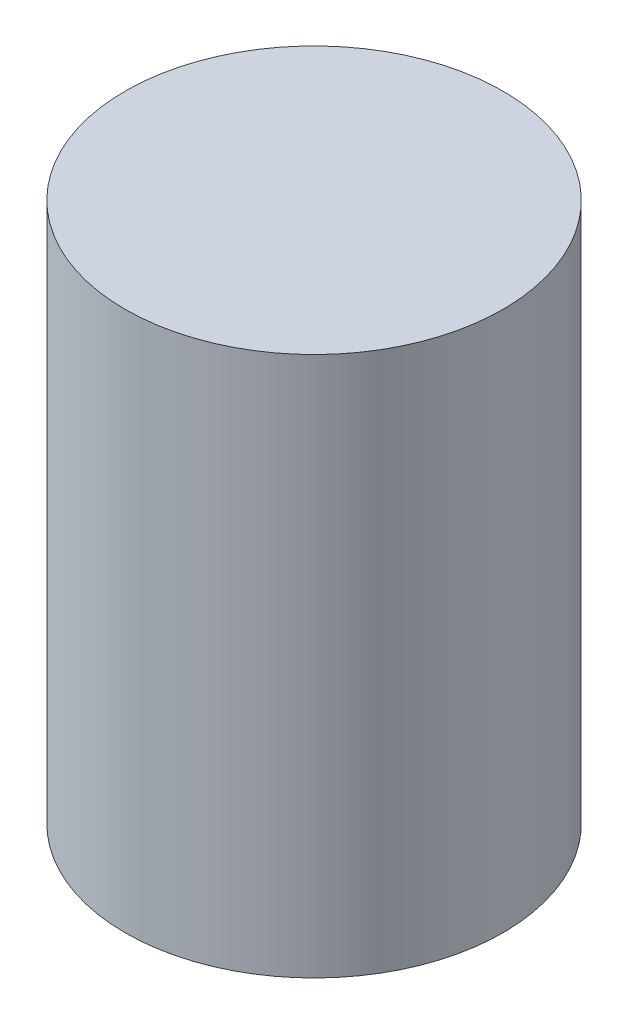
ISO-10303-21;
HEADER;
FILE_DESCRIPTION(('STEP AP214'),'2;1');
FILE_NAME('part.step','',(''),(''),'','','');
FILE_SCHEMA(('AUTOMOTIVE_DESIGN { 1 0 10303 214 1 1 1 1 }'));
ENDSEC;
DATA;
#1=APPLICATION_CONTEXT('core data for automotive mechanical design processes');
#2=APPLICATION_PROTOCOL_DEFINITION('international standard','automotive_design',2000,#1);
#3=PRODUCT_CONTEXT('',#1,'mechanical');
#4=PRODUCT('Part','Part','',(#3));
#5=PRODUCT_RELATED_PRODUCT_CATEGORY('part','',(#4));
#6=PRODUCT_DEFINITION_FORMATION('','',#4);
#7=PRODUCT_DEFINITION_CONTEXT('part definition',#1,'design');
#8=PRODUCT_DEFINITION('design','',#6,#7);
#9=PRODUCT_DEFINITION_SHAPE('','',#8);
#10=(LENGTH_UNIT() NAMED_UNIT(*) SI_UNIT(.MILLI.,.METRE.));
#11=(NAMED_UNIT(*) PLANE_ANGLE_UNIT() SI_UNIT($,.RADIAN.));
#12=(NAMED_UNIT(*) SI_UNIT($,.STERADIAN.) SOLID_ANGLE_UNIT());
#13=UNCERTAINTY_MEASURE_WITH_UNIT(LENGTH_MEASURE(1.E-05),#10,'distance_accuracy_value','');
#14=(GEOMETRIC_REPRESENTATION_CONTEXT(3) GLOBAL_UNCERTAINTY_ASSIGNED_CONTEXT((#13)) GLOBAL_UNIT_ASSIGNED_CONTEXT((#10,
#11,#12)) REPRESENTATION_CONTEXT('',''));
#15=CARTESIAN_POINT('',(0.,0.,0.));
#16=DIRECTION('',(0.,0.,1.));
#17=DIRECTION('',(1.,0.,0.));
#18=AXIS2_PLACEMENT_3D('',#15,#16,#17);
#19=CARTESIAN_POINT('',(0.,30.,0.));
#20=DIRECTION('',(0.,-1.,0.));
#21=DIRECTION('',(0.,0.,-1.));
#22=AXIS2_PLACEMENT_3D('',#19,#20,#21);
#23=CYLINDRICAL_SURFACE('',#22,10.5);
#24=CARTESIAN_POINT('',(0.,30.,0.));
#25=DIRECTION('',(0.,1.,0.));
#26=DIRECTION('',(0.,0.,1.));
#27=AXIS2_PLACEMENT_3D('',#24,#25,#26);
#28=CIRCLE('',#27,10.5);
#29=CARTESIAN_POINT('',(0.,30.,10.5));
#30=VERTEX_POINT('',#29);
#31=EDGE_CURVE('E10',#30,#30,#28,.T.);
#32=ORIENTED_EDGE('',*,*,#31,.F.);
#33=EDGE_LOOP('',(#32));
#34=FACE_BOUND('',#33,.T.);
#35=CARTESIAN_POINT('',(0.,0.,0.));
#36=DIRECTION('',(0.,1.,0.));
#37=DIRECTION('',(0.,0.,1.));
#38=AXIS2_PLACEMENT_3D('',#35,#36,#37);
#39=CIRCLE('',#38,10.5);
#40=CARTESIAN_POINT('',(0.,0.,10.5));
#41=VERTEX_POINT('',#40);
#42=EDGE_CURVE('E34',#41,#41,#39,.T.);
#43=ORIENTED_EDGE('',*,*,#42,.T.);
#44=EDGE_LOOP('',(#43));
#45=FACE_BOUND('',#44,.T.);
#46=ADVANCED_FACE('F31',(#34,#45),#23,.T.);
#47=CARTESIAN_POINT('',(0.,30.,0.));
#48=DIRECTION('',(0.,1.,0.));
#49=DIRECTION('',(0.,0.,1.));
#50=AXIS2_PLACEMENT_3D('',#47,#48,#49);
#51=PLANE('',#50);
#52=ORIENTED_EDGE('',*,*,#31,.T.);
#53=EDGE_LOOP('',(#52));
#54=FACE_BOUND('',#53,.T.);
#55=ADVANCED_FACE('F46',(#54),#51,.T.);
#56=CARTESIAN_POINT('',(0.,0.,0.));
#57=DIRECTION('',(0.,1.,0.));
#58=DIRECTION('',(0.,0.,1.));
#59=AXIS2_PLACEMENT_3D('',#56,#57,#58);
#60=PLANE('',#59);
#61=ORIENTED_EDGE('',*,*,#42,.F.);
#62=EDGE_LOOP('',(#61));
#63=FACE_BOUND('',#62,.T.);
#64=ADVANCED_FACE('F44',(#63),#60,.F.);
#65=CLOSED_SHELL('',(#46,#55,#64));
#66=MANIFOLD_SOLID_BREP('B2',#65);
#67=ADVANCED_BREP_SHAPE_REPRESENTATION('',(#18,#66),#14);
#68=SHAPE_DEFINITION_REPRESENTATION(#9,#67);
ENDSEC;
END-ISO-10303-21;
